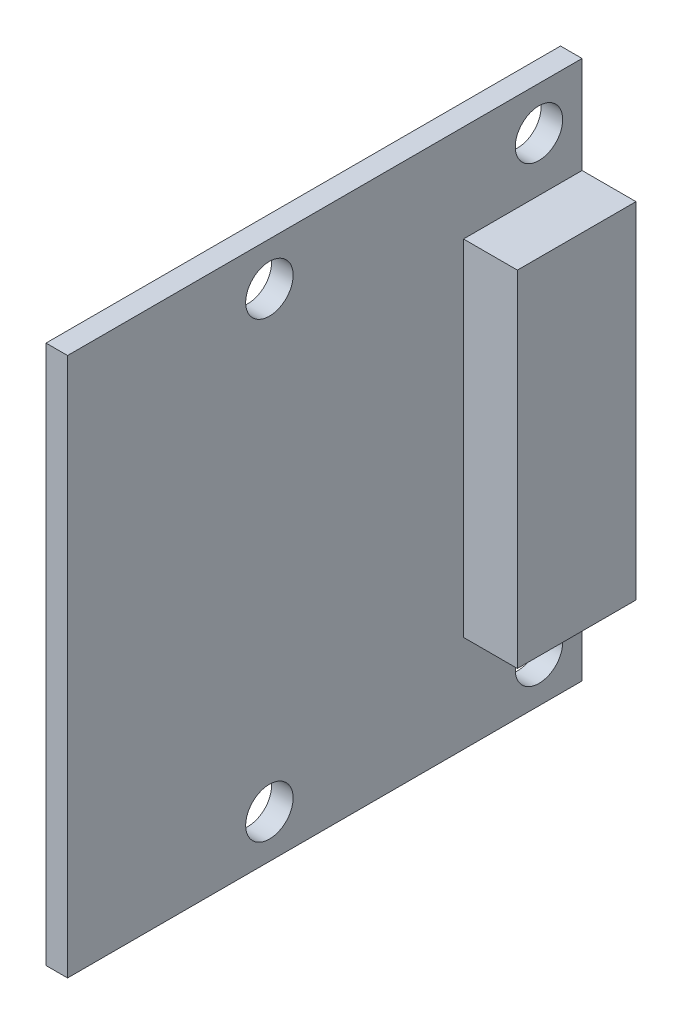
ISO-10303-21;
HEADER;
FILE_DESCRIPTION(('STEP AP214'),'2;1');
FILE_NAME('part.step','',(''),(''),'','','');
FILE_SCHEMA(('AUTOMOTIVE_DESIGN { 1 0 10303 214 1 1 1 1 }'));
ENDSEC;
DATA;
#1=APPLICATION_CONTEXT('core data for automotive mechanical design processes');
#2=APPLICATION_PROTOCOL_DEFINITION('international standard','automotive_design',2000,#1);
#3=PRODUCT_CONTEXT('',#1,'mechanical');
#4=PRODUCT('Part','Part','',(#3));
#5=PRODUCT_RELATED_PRODUCT_CATEGORY('part','',(#4));
#6=PRODUCT_DEFINITION_FORMATION('','',#4);
#7=PRODUCT_DEFINITION_CONTEXT('part definition',#1,'design');
#8=PRODUCT_DEFINITION('design','',#6,#7);
#9=PRODUCT_DEFINITION_SHAPE('','',#8);
#10=(LENGTH_UNIT() NAMED_UNIT(*) SI_UNIT(.MILLI.,.METRE.));
#11=(NAMED_UNIT(*) PLANE_ANGLE_UNIT() SI_UNIT($,.RADIAN.));
#12=(NAMED_UNIT(*) SI_UNIT($,.STERADIAN.) SOLID_ANGLE_UNIT());
#13=UNCERTAINTY_MEASURE_WITH_UNIT(LENGTH_MEASURE(1.E-05),#10,'distance_accuracy_value','');
#14=(GEOMETRIC_REPRESENTATION_CONTEXT(3) GLOBAL_UNCERTAINTY_ASSIGNED_CONTEXT((#13)) GLOBAL_UNIT_ASSIGNED_CONTEXT((#10,
#11,#12)) REPRESENTATION_CONTEXT('',''));
#15=CARTESIAN_POINT('',(0.,0.,0.));
#16=DIRECTION('',(0.,0.,1.));
#17=DIRECTION('',(1.,0.,0.));
#18=AXIS2_PLACEMENT_3D('',#15,#16,#17);
#19=CARTESIAN_POINT('',(-16.9,0.,0.));
#20=DIRECTION('',(1.,0.,0.));
#21=DIRECTION('',(0.,0.,-1.));
#22=AXIS2_PLACEMENT_3D('',#19,#20,#21);
#23=PLANE('',#22);
#24=DIRECTION('',(0.,0.,-1.));
#25=VECTOR('',#24,1.);
#26=CARTESIAN_POINT('',(-16.9,-12.5,106.36));
#27=LINE('',#26,#25);
#28=CARTESIAN_POINT('',(-16.9,-12.5,106.36));
#29=VERTEX_POINT('',#28);
#30=CARTESIAN_POINT('',(-16.9,-12.5,82.5));
#31=VERTEX_POINT('',#30);
#32=EDGE_CURVE('E202',#29,#31,#27,.T.);
#33=ORIENTED_EDGE('',*,*,#32,.F.);
#34=DIRECTION('',(0.,-1.,0.));
#35=VECTOR('',#34,1.);
#36=CARTESIAN_POINT('',(-16.9,12.5,106.36));
#37=LINE('',#36,#35);
#38=CARTESIAN_POINT('',(-16.9,12.5,106.36));
#39=VERTEX_POINT('',#38);
#40=EDGE_CURVE('E207',#39,#29,#37,.T.);
#41=ORIENTED_EDGE('',*,*,#40,.F.);
#42=DIRECTION('',(0.,0.,1.));
#43=VECTOR('',#42,1.);
#44=CARTESIAN_POINT('',(-16.9,12.5,82.5));
#45=LINE('',#44,#43);
#46=CARTESIAN_POINT('',(-16.9,12.5,82.5));
#47=VERTEX_POINT('',#46);
#48=EDGE_CURVE('E219',#47,#39,#45,.T.);
#49=ORIENTED_EDGE('',*,*,#48,.F.);
#50=DIRECTION('',(0.,1.,0.));
#51=VECTOR('',#50,1.);
#52=CARTESIAN_POINT('',(-16.9,-12.5,82.5));
#53=LINE('',#52,#51);
#54=EDGE_CURVE('E217',#31,#47,#53,.T.);
#55=ORIENTED_EDGE('',*,*,#54,.F.);
#56=EDGE_LOOP('',(#33,#41,#49,#55));
#57=FACE_BOUND('',#56,.T.);
#58=CARTESIAN_POINT('',(-16.9,-10.5,97.));
#59=DIRECTION('',(1.,0.,0.));
#60=DIRECTION('',(0.,0.,-1.));
#61=AXIS2_PLACEMENT_3D('',#58,#59,#60);
#62=CIRCLE('',#61,1.1);
#63=CARTESIAN_POINT('',(-16.9,-10.5,95.9));
#64=VERTEX_POINT('',#63);
#65=EDGE_CURVE('E187',#64,#64,#62,.F.);
#66=ORIENTED_EDGE('',*,*,#65,.F.);
#67=EDGE_LOOP('',(#66));
#68=FACE_BOUND('',#67,.T.);
#69=CARTESIAN_POINT('',(-16.9,10.5,84.5));
#70=DIRECTION('',(1.,0.,0.));
#71=DIRECTION('',(0.,0.,-1.));
#72=AXIS2_PLACEMENT_3D('',#69,#70,#71);
#73=CIRCLE('',#72,1.1);
#74=CARTESIAN_POINT('',(-16.9,10.5,83.4));
#75=VERTEX_POINT('',#74);
#76=EDGE_CURVE('E191',#75,#75,#73,.F.);
#77=ORIENTED_EDGE('',*,*,#76,.F.);
#78=EDGE_LOOP('',(#77));
#79=FACE_BOUND('',#78,.T.);
#80=CARTESIAN_POINT('',(-16.9,10.5,97.));
#81=DIRECTION('',(1.,0.,0.));
#82=DIRECTION('',(0.,0.,-1.));
#83=AXIS2_PLACEMENT_3D('',#80,#81,#82);
#84=CIRCLE('',#83,1.1);
#85=CARTESIAN_POINT('',(-16.9,10.5,95.9));
#86=VERTEX_POINT('',#85);
#87=EDGE_CURVE('E195',#86,#86,#84,.F.);
#88=ORIENTED_EDGE('',*,*,#87,.F.);
#89=EDGE_LOOP('',(#88));
#90=FACE_BOUND('',#89,.T.);
#91=CARTESIAN_POINT('',(-16.9,-10.5,84.5));
#92=DIRECTION('',(1.,0.,0.));
#93=DIRECTION('',(0.,0.,-1.));
#94=AXIS2_PLACEMENT_3D('',#91,#92,#93);
#95=CIRCLE('',#94,1.1);
#96=CARTESIAN_POINT('',(-16.9,-10.5,83.4));
#97=VERTEX_POINT('',#96);
#98=EDGE_CURVE('E45',#97,#97,#95,.F.);
#99=ORIENTED_EDGE('',*,*,#98,.F.);
#100=EDGE_LOOP('',(#99));
#101=FACE_BOUND('',#100,.T.);
#102=DIRECTION('',(0.,0.,-1.));
#103=VECTOR('',#102,1.);
#104=CARTESIAN_POINT('',(-16.9,-4.25,101.25));
#105=LINE('',#104,#103);
#106=CARTESIAN_POINT('',(-16.9,-4.25,101.25));
#107=VERTEX_POINT('',#106);
#108=CARTESIAN_POINT('',(-16.9,-4.25,92.75));
#109=VERTEX_POINT('',#108);
#110=EDGE_CURVE('E162',#107,#109,#105,.T.);
#111=ORIENTED_EDGE('',*,*,#110,.T.);
#112=DIRECTION('',(0.,1.,0.));
#113=VECTOR('',#112,1.);
#114=CARTESIAN_POINT('',(-16.9,-4.25,92.75));
#115=LINE('',#114,#113);
#116=CARTESIAN_POINT('',(-16.9,4.25,92.75));
#117=VERTEX_POINT('',#116);
#118=EDGE_CURVE('E164',#109,#117,#115,.T.);
#119=ORIENTED_EDGE('',*,*,#118,.T.);
#120=DIRECTION('',(0.,0.,1.));
#121=VECTOR('',#120,1.);
#122=CARTESIAN_POINT('',(-16.9,4.25,92.75));
#123=LINE('',#122,#121);
#124=CARTESIAN_POINT('',(-16.9,4.25,101.25));
#125=VERTEX_POINT('',#124);
#126=EDGE_CURVE('E167',#117,#125,#123,.T.);
#127=ORIENTED_EDGE('',*,*,#126,.T.);
#128=DIRECTION('',(0.,-1.,0.));
#129=VECTOR('',#128,1.);
#130=CARTESIAN_POINT('',(-16.9,4.25,101.25));
#131=LINE('',#130,#129);
#132=EDGE_CURVE('E169',#125,#107,#131,.T.);
#133=ORIENTED_EDGE('',*,*,#132,.T.);
#134=EDGE_LOOP('',(#111,#119,#127,#133));
#135=FACE_BOUND('',#134,.T.);
#136=ADVANCED_FACE('F41',(#57,#68,#79,#90,#101,#135),#23,.F.);
#137=CARTESIAN_POINT('',(-15.9,-12.5,106.36));
#138=DIRECTION('',(0.,1.,0.));
#139=DIRECTION('',(0.,0.,1.));
#140=AXIS2_PLACEMENT_3D('',#137,#138,#139);
#141=PLANE('',#140);
#142=ORIENTED_EDGE('',*,*,#32,.T.);
#143=DIRECTION('',(-1.,0.,0.));
#144=VECTOR('',#143,1.);
#145=CARTESIAN_POINT('',(-15.9,-12.5,82.5));
#146=LINE('',#145,#144);
#147=CARTESIAN_POINT('',(-15.9,-12.5,82.5));
#148=VERTEX_POINT('',#147);
#149=EDGE_CURVE('E11',#148,#31,#146,.T.);
#150=ORIENTED_EDGE('',*,*,#149,.F.);
#151=DIRECTION('',(0.,0.,-1.));
#152=VECTOR('',#151,1.);
#153=CARTESIAN_POINT('',(-15.9,-12.5,106.36));
#154=LINE('',#153,#152);
#155=CARTESIAN_POINT('',(-15.9,-12.5,106.36));
#156=VERTEX_POINT('',#155);
#157=EDGE_CURVE('E203',#156,#148,#154,.T.);
#158=ORIENTED_EDGE('',*,*,#157,.F.);
#159=DIRECTION('',(-1.,0.,0.));
#160=VECTOR('',#159,1.);
#161=CARTESIAN_POINT('',(-15.9,-12.5,106.36));
#162=LINE('',#161,#160);
#163=EDGE_CURVE('E214',#156,#29,#162,.T.);
#164=ORIENTED_EDGE('',*,*,#163,.T.);
#165=EDGE_LOOP('',(#142,#150,#158,#164));
#166=FACE_BOUND('',#165,.T.);
#167=ADVANCED_FACE('F43',(#166),#141,.F.);
#168=CARTESIAN_POINT('',(-15.9,-12.5,82.5));
#169=DIRECTION('',(0.,0.,1.));
#170=DIRECTION('',(1.,0.,0.));
#171=AXIS2_PLACEMENT_3D('',#168,#169,#170);
#172=PLANE('',#171);
#173=ORIENTED_EDGE('',*,*,#54,.T.);
#174=DIRECTION('',(-1.,0.,0.));
#175=VECTOR('',#174,1.);
#176=CARTESIAN_POINT('',(-15.9,12.5,82.5));
#177=LINE('',#176,#175);
#178=CARTESIAN_POINT('',(-15.9,12.5,82.5));
#179=VERTEX_POINT('',#178);
#180=EDGE_CURVE('E50',#179,#47,#177,.T.);
#181=ORIENTED_EDGE('',*,*,#180,.F.);
#182=DIRECTION('',(0.,1.,0.));
#183=VECTOR('',#182,1.);
#184=CARTESIAN_POINT('',(-15.9,-12.5,82.5));
#185=LINE('',#184,#183);
#186=CARTESIAN_POINT('',(-15.9,8.,82.5));
#187=VERTEX_POINT('',#186);
#188=EDGE_CURVE('E206',#187,#179,#185,.T.);
#189=ORIENTED_EDGE('',*,*,#188,.F.);
#190=DIRECTION('',(-1.,0.,0.));
#191=VECTOR('',#190,1.);
#192=CARTESIAN_POINT('',(-13.4,8.,82.5));
#193=LINE('',#192,#191);
#194=CARTESIAN_POINT('',(-13.4,8.,82.5));
#195=VERTEX_POINT('',#194);
#196=EDGE_CURVE('E137',#195,#187,#193,.T.);
#197=ORIENTED_EDGE('',*,*,#196,.F.);
#198=DIRECTION('',(0.,1.,0.));
#199=VECTOR('',#198,1.);
#200=CARTESIAN_POINT('',(-13.4,-8.,82.5));
#201=LINE('',#200,#199);
#202=CARTESIAN_POINT('',(-13.4,-8.,82.5));
#203=VERTEX_POINT('',#202);
#204=EDGE_CURVE('E131',#203,#195,#201,.T.);
#205=ORIENTED_EDGE('',*,*,#204,.F.);
#206=DIRECTION('',(-1.,0.,0.));
#207=VECTOR('',#206,1.);
#208=CARTESIAN_POINT('',(-13.4,-8.,82.5));
#209=LINE('',#208,#207);
#210=CARTESIAN_POINT('',(-15.9,-8.,82.5));
#211=VERTEX_POINT('',#210);
#212=EDGE_CURVE('E135',#203,#211,#209,.T.);
#213=ORIENTED_EDGE('',*,*,#212,.T.);
#214=EDGE_CURVE('E208',#148,#211,#185,.T.);
#215=ORIENTED_EDGE('',*,*,#214,.F.);
#216=ORIENTED_EDGE('',*,*,#149,.T.);
#217=EDGE_LOOP('',(#173,#181,#189,#197,#205,#213,#215,#216));
#218=FACE_BOUND('',#217,.T.);
#219=ADVANCED_FACE('F133',(#218),#172,.F.);
#220=CARTESIAN_POINT('',(-15.9,12.5,82.5));
#221=DIRECTION('',(0.,-1.,0.));
#222=DIRECTION('',(0.,0.,-1.));
#223=AXIS2_PLACEMENT_3D('',#220,#221,#222);
#224=PLANE('',#223);
#225=ORIENTED_EDGE('',*,*,#48,.T.);
#226=DIRECTION('',(-1.,0.,0.));
#227=VECTOR('',#226,1.);
#228=CARTESIAN_POINT('',(-15.9,12.5,106.36));
#229=LINE('',#228,#227);
#230=CARTESIAN_POINT('',(-15.9,12.5,106.36));
#231=VERTEX_POINT('',#230);
#232=EDGE_CURVE('E224',#231,#39,#229,.T.);
#233=ORIENTED_EDGE('',*,*,#232,.F.);
#234=DIRECTION('',(0.,0.,1.));
#235=VECTOR('',#234,1.);
#236=CARTESIAN_POINT('',(-15.9,12.5,82.5));
#237=LINE('',#236,#235);
#238=EDGE_CURVE('E210',#179,#231,#237,.T.);
#239=ORIENTED_EDGE('',*,*,#238,.F.);
#240=ORIENTED_EDGE('',*,*,#180,.T.);
#241=EDGE_LOOP('',(#225,#233,#239,#240));
#242=FACE_BOUND('',#241,.T.);
#243=ADVANCED_FACE('F300',(#242),#224,.F.);
#244=CARTESIAN_POINT('',(-15.9,12.5,106.36));
#245=DIRECTION('',(0.,0.,-1.));
#246=DIRECTION('',(-1.,0.,0.));
#247=AXIS2_PLACEMENT_3D('',#244,#245,#246);
#248=PLANE('',#247);
#249=ORIENTED_EDGE('',*,*,#40,.T.);
#250=ORIENTED_EDGE('',*,*,#163,.F.);
#251=DIRECTION('',(0.,-1.,0.));
#252=VECTOR('',#251,1.);
#253=CARTESIAN_POINT('',(-15.9,12.5,106.36));
#254=LINE('',#253,#252);
#255=EDGE_CURVE('E212',#231,#156,#254,.T.);
#256=ORIENTED_EDGE('',*,*,#255,.F.);
#257=ORIENTED_EDGE('',*,*,#232,.T.);
#258=EDGE_LOOP('',(#249,#250,#256,#257));
#259=FACE_BOUND('',#258,.T.);
#260=ADVANCED_FACE('F296',(#259),#248,.F.);
#261=CARTESIAN_POINT('',(-15.9,0.,0.));
#262=DIRECTION('',(1.,0.,0.));
#263=DIRECTION('',(0.,0.,-1.));
#264=AXIS2_PLACEMENT_3D('',#261,#262,#263);
#265=PLANE('',#264);
#266=DIRECTION('',(0.,0.,-1.));
#267=VECTOR('',#266,1.);
#268=CARTESIAN_POINT('',(-15.9,-8.,88.));
#269=LINE('',#268,#267);
#270=CARTESIAN_POINT('',(-15.9,-8.,88.));
#271=VERTEX_POINT('',#270);
#272=EDGE_CURVE('E58',#271,#211,#269,.T.);
#273=ORIENTED_EDGE('',*,*,#272,.F.);
#274=DIRECTION('',(0.,-1.,0.));
#275=VECTOR('',#274,1.);
#276=CARTESIAN_POINT('',(-15.9,8.,88.));
#277=LINE('',#276,#275);
#278=CARTESIAN_POINT('',(-15.9,8.,88.));
#279=VERTEX_POINT('',#278);
#280=EDGE_CURVE('E150',#279,#271,#277,.T.);
#281=ORIENTED_EDGE('',*,*,#280,.F.);
#282=DIRECTION('',(0.,0.,1.));
#283=VECTOR('',#282,1.);
#284=CARTESIAN_POINT('',(-15.9,8.,82.5));
#285=LINE('',#284,#283);
#286=EDGE_CURVE('E64',#187,#279,#285,.T.);
#287=ORIENTED_EDGE('',*,*,#286,.F.);
#288=ORIENTED_EDGE('',*,*,#188,.T.);
#289=ORIENTED_EDGE('',*,*,#238,.T.);
#290=ORIENTED_EDGE('',*,*,#255,.T.);
#291=ORIENTED_EDGE('',*,*,#157,.T.);
#292=ORIENTED_EDGE('',*,*,#214,.T.);
#293=EDGE_LOOP('',(#273,#281,#287,#288,#289,#290,#291,#292));
#294=FACE_BOUND('',#293,.T.);
#295=CARTESIAN_POINT('',(-15.9,-10.5,84.5));
#296=DIRECTION('',(1.,0.,0.));
#297=DIRECTION('',(0.,0.,-1.));
#298=AXIS2_PLACEMENT_3D('',#295,#296,#297);
#299=CIRCLE('',#298,1.1);
#300=CARTESIAN_POINT('',(-15.9,-10.5,83.4));
#301=VERTEX_POINT('',#300);
#302=EDGE_CURVE('E199',#301,#301,#299,.F.);
#303=ORIENTED_EDGE('',*,*,#302,.T.);
#304=EDGE_LOOP('',(#303));
#305=FACE_BOUND('',#304,.T.);
#306=CARTESIAN_POINT('',(-15.9,10.5,97.));
#307=DIRECTION('',(1.,0.,0.));
#308=DIRECTION('',(0.,0.,-1.));
#309=AXIS2_PLACEMENT_3D('',#306,#307,#308);
#310=CIRCLE('',#309,1.1);
#311=CARTESIAN_POINT('',(-15.9,10.5,95.9));
#312=VERTEX_POINT('',#311);
#313=EDGE_CURVE('E196',#312,#312,#310,.F.);
#314=ORIENTED_EDGE('',*,*,#313,.T.);
#315=EDGE_LOOP('',(#314));
#316=FACE_BOUND('',#315,.T.);
#317=CARTESIAN_POINT('',(-15.9,10.5,84.5));
#318=DIRECTION('',(1.,0.,0.));
#319=DIRECTION('',(0.,0.,-1.));
#320=AXIS2_PLACEMENT_3D('',#317,#318,#319);
#321=CIRCLE('',#320,1.1);
#322=CARTESIAN_POINT('',(-15.9,10.5,83.4));
#323=VERTEX_POINT('',#322);
#324=EDGE_CURVE('E192',#323,#323,#321,.F.);
#325=ORIENTED_EDGE('',*,*,#324,.T.);
#326=EDGE_LOOP('',(#325));
#327=FACE_BOUND('',#326,.T.);
#328=CARTESIAN_POINT('',(-15.9,-10.5,97.));
#329=DIRECTION('',(1.,0.,0.));
#330=DIRECTION('',(0.,0.,-1.));
#331=AXIS2_PLACEMENT_3D('',#328,#329,#330);
#332=CIRCLE('',#331,1.1);
#333=CARTESIAN_POINT('',(-15.9,-10.5,95.9));
#334=VERTEX_POINT('',#333);
#335=EDGE_CURVE('E188',#334,#334,#332,.F.);
#336=ORIENTED_EDGE('',*,*,#335,.T.);
#337=EDGE_LOOP('',(#336));
#338=FACE_BOUND('',#337,.T.);
#339=ADVANCED_FACE('F293',(#294,#305,#316,#327,#338),#265,.T.);
#340=CARTESIAN_POINT('',(-14.9,-10.5,97.));
#341=DIRECTION('',(-1.,0.,0.));
#342=DIRECTION('',(0.,0.,1.));
#343=AXIS2_PLACEMENT_3D('',#340,#341,#342);
#344=CYLINDRICAL_SURFACE('',#343,1.1);
#345=ORIENTED_EDGE('',*,*,#335,.F.);
#346=EDGE_LOOP('',(#345));
#347=FACE_BOUND('',#346,.T.);
#348=ORIENTED_EDGE('',*,*,#65,.T.);
#349=EDGE_LOOP('',(#348));
#350=FACE_BOUND('',#349,.T.);
#351=ADVANCED_FACE('F283',(#347,#350),#344,.F.);
#352=CARTESIAN_POINT('',(-14.9,10.5,84.5));
#353=DIRECTION('',(-1.,0.,0.));
#354=DIRECTION('',(0.,0.,1.));
#355=AXIS2_PLACEMENT_3D('',#352,#353,#354);
#356=CYLINDRICAL_SURFACE('',#355,1.1);
#357=ORIENTED_EDGE('',*,*,#324,.F.);
#358=EDGE_LOOP('',(#357));
#359=FACE_BOUND('',#358,.T.);
#360=ORIENTED_EDGE('',*,*,#76,.T.);
#361=EDGE_LOOP('',(#360));
#362=FACE_BOUND('',#361,.T.);
#363=ADVANCED_FACE('F280',(#359,#362),#356,.F.);
#364=CARTESIAN_POINT('',(-14.9,10.5,97.));
#365=DIRECTION('',(-1.,0.,0.));
#366=DIRECTION('',(0.,0.,1.));
#367=AXIS2_PLACEMENT_3D('',#364,#365,#366);
#368=CYLINDRICAL_SURFACE('',#367,1.1);
#369=ORIENTED_EDGE('',*,*,#313,.F.);
#370=EDGE_LOOP('',(#369));
#371=FACE_BOUND('',#370,.T.);
#372=ORIENTED_EDGE('',*,*,#87,.T.);
#373=EDGE_LOOP('',(#372));
#374=FACE_BOUND('',#373,.T.);
#375=ADVANCED_FACE('F235',(#371,#374),#368,.F.);
#376=CARTESIAN_POINT('',(-14.9,-10.5,84.5));
#377=DIRECTION('',(-1.,0.,0.));
#378=DIRECTION('',(0.,0.,1.));
#379=AXIS2_PLACEMENT_3D('',#376,#377,#378);
#380=CYLINDRICAL_SURFACE('',#379,1.1);
#381=ORIENTED_EDGE('',*,*,#302,.F.);
#382=EDGE_LOOP('',(#381));
#383=FACE_BOUND('',#382,.T.);
#384=ORIENTED_EDGE('',*,*,#98,.T.);
#385=EDGE_LOOP('',(#384));
#386=FACE_BOUND('',#385,.T.);
#387=ADVANCED_FACE('F279',(#383,#386),#380,.F.);
#388=CARTESIAN_POINT('',(-16.9,-4.25,101.25));
#389=DIRECTION('',(0.,1.,0.));
#390=DIRECTION('',(0.,0.,1.));
#391=AXIS2_PLACEMENT_3D('',#388,#389,#390);
#392=PLANE('',#391);
#393=DIRECTION('',(0.,0.,-1.));
#394=VECTOR('',#393,1.);
#395=CARTESIAN_POINT('',(-21.4,-4.25,101.25));
#396=LINE('',#395,#394);
#397=CARTESIAN_POINT('',(-21.4,-4.25,101.25));
#398=VERTEX_POINT('',#397);
#399=CARTESIAN_POINT('',(-21.4,-4.25,92.75));
#400=VERTEX_POINT('',#399);
#401=EDGE_CURVE('E153',#398,#400,#396,.T.);
#402=ORIENTED_EDGE('',*,*,#401,.T.);
#403=DIRECTION('',(-1.,0.,0.));
#404=VECTOR('',#403,1.);
#405=CARTESIAN_POINT('',(-16.9,-4.25,92.75));
#406=LINE('',#405,#404);
#407=EDGE_CURVE('E184',#109,#400,#406,.T.);
#408=ORIENTED_EDGE('',*,*,#407,.F.);
#409=ORIENTED_EDGE('',*,*,#110,.F.);
#410=DIRECTION('',(-1.,0.,0.));
#411=VECTOR('',#410,1.);
#412=CARTESIAN_POINT('',(-16.9,-4.25,101.25));
#413=LINE('',#412,#411);
#414=EDGE_CURVE('E170',#107,#398,#413,.T.);
#415=ORIENTED_EDGE('',*,*,#414,.T.);
#416=EDGE_LOOP('',(#402,#408,#409,#415));
#417=FACE_BOUND('',#416,.T.);
#418=ADVANCED_FACE('F254',(#417),#392,.F.);
#419=CARTESIAN_POINT('',(-16.9,-4.25,92.75));
#420=DIRECTION('',(0.,0.,1.));
#421=DIRECTION('',(1.,0.,0.));
#422=AXIS2_PLACEMENT_3D('',#419,#420,#421);
#423=PLANE('',#422);
#424=DIRECTION('',(0.,1.,0.));
#425=VECTOR('',#424,1.);
#426=CARTESIAN_POINT('',(-21.4,-4.25,92.75));
#427=LINE('',#426,#425);
#428=CARTESIAN_POINT('',(-21.4,4.25,92.75));
#429=VERTEX_POINT('',#428);
#430=EDGE_CURVE('E156',#400,#429,#427,.T.);
#431=ORIENTED_EDGE('',*,*,#430,.T.);
#432=DIRECTION('',(-1.,0.,0.));
#433=VECTOR('',#432,1.);
#434=CARTESIAN_POINT('',(-16.9,4.25,92.75));
#435=LINE('',#434,#433);
#436=EDGE_CURVE('E181',#117,#429,#435,.T.);
#437=ORIENTED_EDGE('',*,*,#436,.F.);
#438=ORIENTED_EDGE('',*,*,#118,.F.);
#439=ORIENTED_EDGE('',*,*,#407,.T.);
#440=EDGE_LOOP('',(#431,#437,#438,#439));
#441=FACE_BOUND('',#440,.T.);
#442=ADVANCED_FACE('F252',(#441),#423,.F.);
#443=CARTESIAN_POINT('',(-16.9,4.25,92.75));
#444=DIRECTION('',(0.,-1.,0.));
#445=DIRECTION('',(0.,0.,-1.));
#446=AXIS2_PLACEMENT_3D('',#443,#444,#445);
#447=PLANE('',#446);
#448=DIRECTION('',(0.,0.,1.));
#449=VECTOR('',#448,1.);
#450=CARTESIAN_POINT('',(-21.4,4.25,92.75));
#451=LINE('',#450,#449);
#452=CARTESIAN_POINT('',(-21.4,4.25,101.25));
#453=VERTEX_POINT('',#452);
#454=EDGE_CURVE('E173',#429,#453,#451,.T.);
#455=ORIENTED_EDGE('',*,*,#454,.T.);
#456=DIRECTION('',(-1.,0.,0.));
#457=VECTOR('',#456,1.);
#458=CARTESIAN_POINT('',(-16.9,4.25,101.25));
#459=LINE('',#458,#457);
#460=EDGE_CURVE('E178',#125,#453,#459,.T.);
#461=ORIENTED_EDGE('',*,*,#460,.F.);
#462=ORIENTED_EDGE('',*,*,#126,.F.);
#463=ORIENTED_EDGE('',*,*,#436,.T.);
#464=EDGE_LOOP('',(#455,#461,#462,#463));
#465=FACE_BOUND('',#464,.T.);
#466=ADVANCED_FACE('F261',(#465),#447,.F.);
#467=CARTESIAN_POINT('',(-16.9,4.25,101.25));
#468=DIRECTION('',(0.,0.,-1.));
#469=DIRECTION('',(-1.,0.,0.));
#470=AXIS2_PLACEMENT_3D('',#467,#468,#469);
#471=PLANE('',#470);
#472=DIRECTION('',(0.,-1.,0.));
#473=VECTOR('',#472,1.);
#474=CARTESIAN_POINT('',(-21.4,4.25,101.25));
#475=LINE('',#474,#473);
#476=EDGE_CURVE('E165',#453,#398,#475,.T.);
#477=ORIENTED_EDGE('',*,*,#476,.T.);
#478=ORIENTED_EDGE('',*,*,#414,.F.);
#479=ORIENTED_EDGE('',*,*,#132,.F.);
#480=ORIENTED_EDGE('',*,*,#460,.T.);
#481=EDGE_LOOP('',(#477,#478,#479,#480));
#482=FACE_BOUND('',#481,.T.);
#483=ADVANCED_FACE('F264',(#482),#471,.F.);
#484=CARTESIAN_POINT('',(-21.4,0.,0.));
#485=DIRECTION('',(1.,0.,0.));
#486=DIRECTION('',(0.,0.,-1.));
#487=AXIS2_PLACEMENT_3D('',#484,#485,#486);
#488=PLANE('',#487);
#489=ORIENTED_EDGE('',*,*,#401,.F.);
#490=ORIENTED_EDGE('',*,*,#476,.F.);
#491=ORIENTED_EDGE('',*,*,#454,.F.);
#492=ORIENTED_EDGE('',*,*,#430,.F.);
#493=EDGE_LOOP('',(#489,#490,#491,#492));
#494=FACE_BOUND('',#493,.T.);
#495=ADVANCED_FACE('F258',(#494),#488,.F.);
#496=CARTESIAN_POINT('',(-13.4,-8.,88.));
#497=DIRECTION('',(0.,1.,0.));
#498=DIRECTION('',(0.,0.,1.));
#499=AXIS2_PLACEMENT_3D('',#496,#497,#498);
#500=PLANE('',#499);
#501=ORIENTED_EDGE('',*,*,#272,.T.);
#502=ORIENTED_EDGE('',*,*,#212,.F.);
#503=DIRECTION('',(0.,0.,-1.));
#504=VECTOR('',#503,1.);
#505=CARTESIAN_POINT('',(-13.4,-8.,88.));
#506=LINE('',#505,#504);
#507=CARTESIAN_POINT('',(-13.4,-8.,88.));
#508=VERTEX_POINT('',#507);
#509=EDGE_CURVE('E141',#508,#203,#506,.T.);
#510=ORIENTED_EDGE('',*,*,#509,.F.);
#511=DIRECTION('',(-1.,0.,0.));
#512=VECTOR('',#511,1.);
#513=CARTESIAN_POINT('',(-13.4,-8.,88.));
#514=LINE('',#513,#512);
#515=EDGE_CURVE('E328',#508,#271,#514,.T.);
#516=ORIENTED_EDGE('',*,*,#515,.T.);
#517=EDGE_LOOP('',(#501,#502,#510,#516));
#518=FACE_BOUND('',#517,.T.);
#519=ADVANCED_FACE('F152',(#518),#500,.F.);
#520=CARTESIAN_POINT('',(-13.4,8.,82.5));
#521=DIRECTION('',(0.,-1.,0.));
#522=DIRECTION('',(0.,0.,-1.));
#523=AXIS2_PLACEMENT_3D('',#520,#521,#522);
#524=PLANE('',#523);
#525=ORIENTED_EDGE('',*,*,#286,.T.);
#526=DIRECTION('',(-1.,0.,0.));
#527=VECTOR('',#526,1.);
#528=CARTESIAN_POINT('',(-13.4,8.,88.));
#529=LINE('',#528,#527);
#530=CARTESIAN_POINT('',(-13.4,8.,88.));
#531=VERTEX_POINT('',#530);
#532=EDGE_CURVE('E158',#531,#279,#529,.T.);
#533=ORIENTED_EDGE('',*,*,#532,.F.);
#534=DIRECTION('',(0.,0.,1.));
#535=VECTOR('',#534,1.);
#536=CARTESIAN_POINT('',(-13.4,8.,82.5));
#537=LINE('',#536,#535);
#538=EDGE_CURVE('E140',#195,#531,#537,.T.);
#539=ORIENTED_EDGE('',*,*,#538,.F.);
#540=ORIENTED_EDGE('',*,*,#196,.T.);
#541=EDGE_LOOP('',(#525,#533,#539,#540));
#542=FACE_BOUND('',#541,.T.);
#543=ADVANCED_FACE('F324',(#542),#524,.F.);
#544=CARTESIAN_POINT('',(-13.4,8.,88.));
#545=DIRECTION('',(0.,0.,-1.));
#546=DIRECTION('',(-1.,0.,0.));
#547=AXIS2_PLACEMENT_3D('',#544,#545,#546);
#548=PLANE('',#547);
#549=ORIENTED_EDGE('',*,*,#280,.T.);
#550=ORIENTED_EDGE('',*,*,#515,.F.);
#551=DIRECTION('',(0.,-1.,0.));
#552=VECTOR('',#551,1.);
#553=CARTESIAN_POINT('',(-13.4,8.,88.));
#554=LINE('',#553,#552);
#555=EDGE_CURVE('E146',#531,#508,#554,.T.);
#556=ORIENTED_EDGE('',*,*,#555,.F.);
#557=ORIENTED_EDGE('',*,*,#532,.T.);
#558=EDGE_LOOP('',(#549,#550,#556,#557));
#559=FACE_BOUND('',#558,.T.);
#560=ADVANCED_FACE('F335',(#559),#548,.F.);
#561=CARTESIAN_POINT('',(-13.4,0.,0.));
#562=DIRECTION('',(1.,0.,0.));
#563=DIRECTION('',(0.,0.,-1.));
#564=AXIS2_PLACEMENT_3D('',#561,#562,#563);
#565=PLANE('',#564);
#566=ORIENTED_EDGE('',*,*,#509,.T.);
#567=ORIENTED_EDGE('',*,*,#204,.T.);
#568=ORIENTED_EDGE('',*,*,#538,.T.);
#569=ORIENTED_EDGE('',*,*,#555,.T.);
#570=EDGE_LOOP('',(#566,#567,#568,#569));
#571=FACE_BOUND('',#570,.T.);
#572=ADVANCED_FACE('F144',(#571),#565,.T.);
#573=CLOSED_SHELL('',(#136,#167,#219,#243,#260,#339,#351,#363,#375,#387,#418,#442,#466,#483,
#495,#519,#543,#560,#572));
#574=MANIFOLD_SOLID_BREP('B2',#573);
#575=ADVANCED_BREP_SHAPE_REPRESENTATION('',(#18,#574),#14);
#576=SHAPE_DEFINITION_REPRESENTATION(#9,#575);
ENDSEC;
END-ISO-10303-21;
